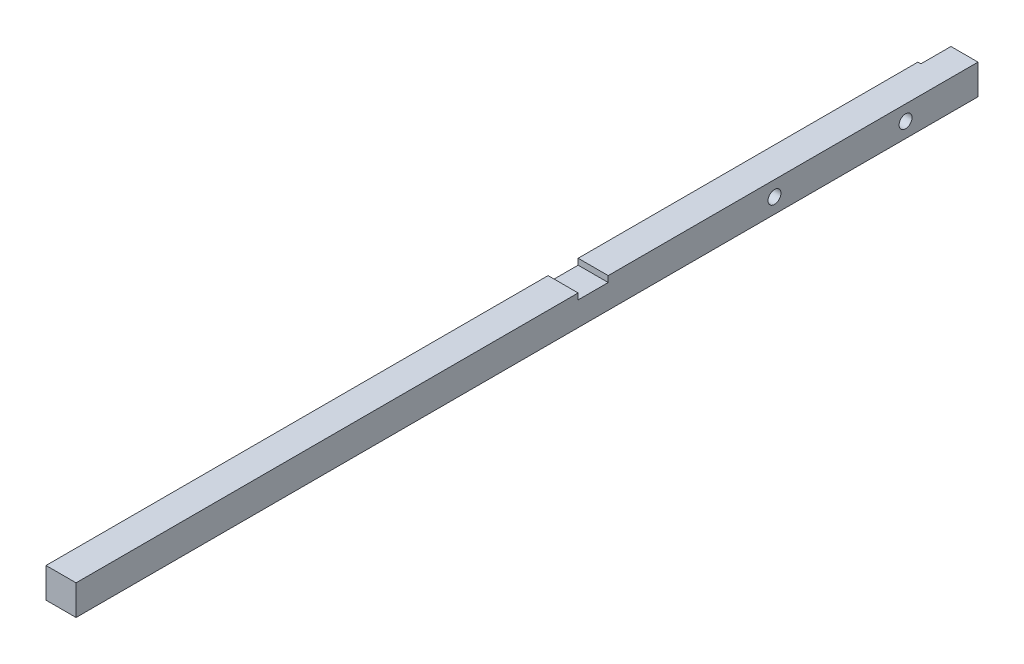
ISO-10303-21;
HEADER;
FILE_DESCRIPTION(('STEP AP214'),'2;1');
FILE_NAME('part.step','',(''),(''),'','','');
FILE_SCHEMA(('AUTOMOTIVE_DESIGN { 1 0 10303 214 1 1 1 1 }'));
ENDSEC;
DATA;
#1=APPLICATION_CONTEXT('core data for automotive mechanical design processes');
#2=APPLICATION_PROTOCOL_DEFINITION('international standard','automotive_design',2000,#1);
#3=PRODUCT_CONTEXT('',#1,'mechanical');
#4=PRODUCT('Part','Part','',(#3));
#5=PRODUCT_RELATED_PRODUCT_CATEGORY('part','',(#4));
#6=PRODUCT_DEFINITION_FORMATION('','',#4);
#7=PRODUCT_DEFINITION_CONTEXT('part definition',#1,'design');
#8=PRODUCT_DEFINITION('design','',#6,#7);
#9=PRODUCT_DEFINITION_SHAPE('','',#8);
#10=(LENGTH_UNIT() NAMED_UNIT(*) SI_UNIT(.MILLI.,.METRE.));
#11=(NAMED_UNIT(*) PLANE_ANGLE_UNIT() SI_UNIT($,.RADIAN.));
#12=(NAMED_UNIT(*) SI_UNIT($,.STERADIAN.) SOLID_ANGLE_UNIT());
#13=UNCERTAINTY_MEASURE_WITH_UNIT(LENGTH_MEASURE(1.E-05),#10,'distance_accuracy_value','');
#14=(GEOMETRIC_REPRESENTATION_CONTEXT(3) GLOBAL_UNCERTAINTY_ASSIGNED_CONTEXT((#13)) GLOBAL_UNIT_ASSIGNED_CONTEXT((#10,
#11,#12)) REPRESENTATION_CONTEXT('',''));
#15=CARTESIAN_POINT('',(0.,0.,0.));
#16=DIRECTION('',(0.,0.,1.));
#17=DIRECTION('',(1.,0.,0.));
#18=AXIS2_PLACEMENT_3D('',#15,#16,#17);
#19=CARTESIAN_POINT('',(-5.,5.,323.142135623731));
#20=DIRECTION('',(0.,-1.,0.));
#21=DIRECTION('',(0.,0.,-1.));
#22=AXIS2_PLACEMENT_3D('',#19,#20,#21);
#23=PLANE('',#22);
#24=DIRECTION('',(0.,0.,-1.));
#25=VECTOR('',#24,1.);
#26=CARTESIAN_POINT('',(5.,5.,323.142135623731));
#27=LINE('',#26,#25);
#28=CARTESIAN_POINT('',(5.,5.,307.));
#29=VERTEX_POINT('',#28);
#30=CARTESIAN_POINT('',(5.,5.,140.));
#31=VERTEX_POINT('',#30);
#32=EDGE_CURVE('E151',#29,#31,#27,.T.);
#33=ORIENTED_EDGE('',*,*,#32,.T.);
#34=DIRECTION('',(1.,0.,0.));
#35=VECTOR('',#34,1.);
#36=CARTESIAN_POINT('',(-5.,5.,140.));
#37=LINE('',#36,#35);
#38=CARTESIAN_POINT('',(-5.,5.,140.));
#39=VERTEX_POINT('',#38);
#40=EDGE_CURVE('E191',#39,#31,#37,.T.);
#41=ORIENTED_EDGE('',*,*,#40,.F.);
#42=DIRECTION('',(0.,0.,-1.));
#43=VECTOR('',#42,1.);
#44=CARTESIAN_POINT('',(-5.,5.,323.142135623731));
#45=LINE('',#44,#43);
#46=CARTESIAN_POINT('',(-5.,5.,307.));
#47=VERTEX_POINT('',#46);
#48=EDGE_CURVE('E37',#47,#39,#45,.T.);
#49=ORIENTED_EDGE('',*,*,#48,.F.);
#50=DIRECTION('',(-1.,0.,0.));
#51=VECTOR('',#50,1.);
#52=CARTESIAN_POINT('',(-5.,5.,307.));
#53=LINE('',#52,#51);
#54=EDGE_CURVE('E148',#29,#47,#53,.T.);
#55=ORIENTED_EDGE('',*,*,#54,.F.);
#56=EDGE_LOOP('',(#33,#41,#49,#55));
#57=FACE_BOUND('',#56,.T.);
#58=ADVANCED_FACE('F33',(#57),#23,.F.);
#59=CARTESIAN_POINT('',(-5.,5.,323.142135623731));
#60=DIRECTION('',(1.,0.,0.));
#61=DIRECTION('',(0.,1.,0.));
#62=AXIS2_PLACEMENT_3D('',#59,#60,#61);
#63=PLANE('',#62);
#64=CARTESIAN_POINT('',(-5.,0.,74.69));
#65=DIRECTION('',(-1.,0.,0.));
#66=DIRECTION('',(0.,0.,1.));
#67=AXIS2_PLACEMENT_3D('',#64,#65,#66);
#68=CIRCLE('',#67,2.14999999999999);
#69=CARTESIAN_POINT('',(-5.,0.,76.84));
#70=VERTEX_POINT('',#69);
#71=EDGE_CURVE('E255',#70,#70,#68,.T.);
#72=ORIENTED_EDGE('',*,*,#71,.F.);
#73=EDGE_LOOP('',(#72));
#74=FACE_BOUND('',#73,.T.);
#75=CARTESIAN_POINT('',(-5.,0.,31.09));
#76=DIRECTION('',(-1.,0.,0.));
#77=DIRECTION('',(0.,0.,1.));
#78=AXIS2_PLACEMENT_3D('',#75,#76,#77);
#79=CIRCLE('',#78,2.14999999999999);
#80=CARTESIAN_POINT('',(-5.,0.,33.24));
#81=VERTEX_POINT('',#80);
#82=EDGE_CURVE('E249',#81,#81,#79,.T.);
#83=ORIENTED_EDGE('',*,*,#82,.F.);
#84=EDGE_LOOP('',(#83));
#85=FACE_BOUND('',#84,.T.);
#86=CARTESIAN_POINT('',(-5.,5.,130.));
#87=VERTEX_POINT('',#86);
#88=CARTESIAN_POINT('',(-5.,4.99999999999999,17.));
#89=VERTEX_POINT('',#88);
#90=EDGE_CURVE('E193',#87,#89,#45,.T.);
#91=ORIENTED_EDGE('',*,*,#90,.T.);
#92=DIRECTION('',(0.,1.,0.));
#93=VECTOR('',#92,1.);
#94=CARTESIAN_POINT('',(-5.,-5.,17.));
#95=LINE('',#94,#93);
#96=CARTESIAN_POINT('',(-5.,-5.,17.));
#97=VERTEX_POINT('',#96);
#98=EDGE_CURVE('E120',#97,#89,#95,.T.);
#99=ORIENTED_EDGE('',*,*,#98,.F.);
#100=DIRECTION('',(0.,0.,-1.));
#101=VECTOR('',#100,1.);
#102=CARTESIAN_POINT('',(-5.,-5.,323.142135623731));
#103=LINE('',#102,#101);
#104=CARTESIAN_POINT('',(-5.,-5.,307.));
#105=VERTEX_POINT('',#104);
#106=EDGE_CURVE('E136',#105,#97,#103,.T.);
#107=ORIENTED_EDGE('',*,*,#106,.F.);
#108=DIRECTION('',(0.,-1.,0.));
#109=VECTOR('',#108,1.);
#110=CARTESIAN_POINT('',(-5.,5.,307.));
#111=LINE('',#110,#109);
#112=EDGE_CURVE('E145',#47,#105,#111,.T.);
#113=ORIENTED_EDGE('',*,*,#112,.F.);
#114=ORIENTED_EDGE('',*,*,#48,.T.);
#115=DIRECTION('',(0.,-1.,0.));
#116=VECTOR('',#115,1.);
#117=CARTESIAN_POINT('',(-5.,5.,140.));
#118=LINE('',#117,#116);
#119=CARTESIAN_POINT('',(-5.,3.,140.));
#120=VERTEX_POINT('',#119);
#121=EDGE_CURVE('E175',#39,#120,#118,.T.);
#122=ORIENTED_EDGE('',*,*,#121,.T.);
#123=DIRECTION('',(0.,0.,-1.));
#124=VECTOR('',#123,1.);
#125=CARTESIAN_POINT('',(-5.,3.,140.));
#126=LINE('',#125,#124);
#127=CARTESIAN_POINT('',(-5.,3.,130.));
#128=VERTEX_POINT('',#127);
#129=EDGE_CURVE('E178',#120,#128,#126,.T.);
#130=ORIENTED_EDGE('',*,*,#129,.T.);
#131=DIRECTION('',(0.,1.,0.));
#132=VECTOR('',#131,1.);
#133=CARTESIAN_POINT('',(-5.,5.,130.));
#134=LINE('',#133,#132);
#135=EDGE_CURVE('E181',#128,#87,#134,.T.);
#136=ORIENTED_EDGE('',*,*,#135,.T.);
#137=EDGE_LOOP('',(#91,#99,#107,#113,#114,#122,#130,#136));
#138=FACE_BOUND('',#137,.T.);
#139=ADVANCED_FACE('F210',(#74,#85,#138),#63,.F.);
#140=CARTESIAN_POINT('',(-5.,-5.,323.142135623731));
#141=DIRECTION('',(0.,1.,0.));
#142=DIRECTION('',(0.,0.,1.));
#143=AXIS2_PLACEMENT_3D('',#140,#141,#142);
#144=PLANE('',#143);
#145=ORIENTED_EDGE('',*,*,#106,.T.);
#146=DIRECTION('',(-1.,0.,0.));
#147=VECTOR('',#146,1.);
#148=CARTESIAN_POINT('',(-4.,-5.,17.));
#149=LINE('',#148,#147);
#150=CARTESIAN_POINT('',(-4.,-5.,17.));
#151=VERTEX_POINT('',#150);
#152=EDGE_CURVE('E128',#151,#97,#149,.T.);
#153=ORIENTED_EDGE('',*,*,#152,.F.);
#154=DIRECTION('',(0.,0.,1.));
#155=VECTOR('',#154,1.);
#156=CARTESIAN_POINT('',(-4.,-5.,7.));
#157=LINE('',#156,#155);
#158=CARTESIAN_POINT('',(-4.,-5.,7.));
#159=VERTEX_POINT('',#158);
#160=EDGE_CURVE('E114',#159,#151,#157,.T.);
#161=ORIENTED_EDGE('',*,*,#160,.F.);
#162=DIRECTION('',(1.,0.,0.));
#163=VECTOR('',#162,1.);
#164=CARTESIAN_POINT('',(-5.,-5.,7.));
#165=LINE('',#164,#163);
#166=CARTESIAN_POINT('',(5.,-5.,7.));
#167=VERTEX_POINT('',#166);
#168=EDGE_CURVE('E126',#159,#167,#165,.T.);
#169=ORIENTED_EDGE('',*,*,#168,.T.);
#170=DIRECTION('',(0.,0.,-1.));
#171=VECTOR('',#170,1.);
#172=CARTESIAN_POINT('',(5.,-5.,323.142135623731));
#173=LINE('',#172,#171);
#174=CARTESIAN_POINT('',(5.,-5.,307.));
#175=VERTEX_POINT('',#174);
#176=EDGE_CURVE('E135',#175,#167,#173,.T.);
#177=ORIENTED_EDGE('',*,*,#176,.F.);
#178=DIRECTION('',(1.,0.,0.));
#179=VECTOR('',#178,1.);
#180=CARTESIAN_POINT('',(-5.,-5.,307.));
#181=LINE('',#180,#179);
#182=EDGE_CURVE('E42',#105,#175,#181,.T.);
#183=ORIENTED_EDGE('',*,*,#182,.F.);
#184=EDGE_LOOP('',(#145,#153,#161,#169,#177,#183));
#185=FACE_BOUND('',#184,.T.);
#186=ADVANCED_FACE('F124',(#185),#144,.F.);
#187=CARTESIAN_POINT('',(5.,5.,323.142135623731));
#188=DIRECTION('',(-1.,0.,0.));
#189=DIRECTION('',(0.,-1.,0.));
#190=AXIS2_PLACEMENT_3D('',#187,#188,#189);
#191=PLANE('',#190);
#192=CARTESIAN_POINT('',(5.,0.,74.69));
#193=DIRECTION('',(-1.,0.,0.));
#194=DIRECTION('',(0.,0.,1.));
#195=AXIS2_PLACEMENT_3D('',#192,#193,#194);
#196=CIRCLE('',#195,2.15);
#197=CARTESIAN_POINT('',(5.,0.,76.84));
#198=VERTEX_POINT('',#197);
#199=EDGE_CURVE('E245',#198,#198,#196,.T.);
#200=ORIENTED_EDGE('',*,*,#199,.T.);
#201=EDGE_LOOP('',(#200));
#202=FACE_BOUND('',#201,.T.);
#203=CARTESIAN_POINT('',(5.,0.,31.09));
#204=DIRECTION('',(-1.,0.,0.));
#205=DIRECTION('',(0.,0.,1.));
#206=AXIS2_PLACEMENT_3D('',#203,#204,#205);
#207=CIRCLE('',#206,2.15);
#208=CARTESIAN_POINT('',(5.,0.,33.24));
#209=VERTEX_POINT('',#208);
#210=EDGE_CURVE('E172',#209,#209,#207,.T.);
#211=ORIENTED_EDGE('',*,*,#210,.T.);
#212=EDGE_LOOP('',(#211));
#213=FACE_BOUND('',#212,.T.);
#214=DIRECTION('',(0.,0.,-1.));
#215=VECTOR('',#214,1.);
#216=CARTESIAN_POINT('',(5.,3.,140.));
#217=LINE('',#216,#215);
#218=CARTESIAN_POINT('',(5.,3.,140.));
#219=VERTEX_POINT('',#218);
#220=CARTESIAN_POINT('',(5.,3.,130.));
#221=VERTEX_POINT('',#220);
#222=EDGE_CURVE('E187',#219,#221,#217,.T.);
#223=ORIENTED_EDGE('',*,*,#222,.F.);
#224=DIRECTION('',(0.,-1.,0.));
#225=VECTOR('',#224,1.);
#226=CARTESIAN_POINT('',(5.,5.,140.));
#227=LINE('',#226,#225);
#228=EDGE_CURVE('E173',#31,#219,#227,.T.);
#229=ORIENTED_EDGE('',*,*,#228,.F.);
#230=ORIENTED_EDGE('',*,*,#32,.F.);
#231=DIRECTION('',(0.,1.,0.));
#232=VECTOR('',#231,1.);
#233=CARTESIAN_POINT('',(5.,5.,307.));
#234=LINE('',#233,#232);
#235=EDGE_CURVE('E12',#175,#29,#234,.T.);
#236=ORIENTED_EDGE('',*,*,#235,.F.);
#237=ORIENTED_EDGE('',*,*,#176,.T.);
#238=DIRECTION('',(0.,1.,0.));
#239=VECTOR('',#238,1.);
#240=CARTESIAN_POINT('',(5.,5.,7.));
#241=LINE('',#240,#239);
#242=CARTESIAN_POINT('',(5.,5.,7.));
#243=VERTEX_POINT('',#242);
#244=EDGE_CURVE('E134',#167,#243,#241,.T.);
#245=ORIENTED_EDGE('',*,*,#244,.T.);
#246=CARTESIAN_POINT('',(5.,5.,130.));
#247=VERTEX_POINT('',#246);
#248=EDGE_CURVE('E153',#247,#243,#27,.T.);
#249=ORIENTED_EDGE('',*,*,#248,.F.);
#250=DIRECTION('',(0.,1.,0.));
#251=VECTOR('',#250,1.);
#252=CARTESIAN_POINT('',(5.,5.,130.));
#253=LINE('',#252,#251);
#254=EDGE_CURVE('E58',#221,#247,#253,.T.);
#255=ORIENTED_EDGE('',*,*,#254,.F.);
#256=EDGE_LOOP('',(#223,#229,#230,#236,#237,#245,#249,#255));
#257=FACE_BOUND('',#256,.T.);
#258=ADVANCED_FACE('F161',(#202,#213,#257),#191,.F.);
#259=DIRECTION('',(0.,0.,-1.));
#260=VECTOR('',#259,1.);
#261=CARTESIAN_POINT('',(-4.,4.99999999999999,7.));
#262=LINE('',#261,#260);
#263=CARTESIAN_POINT('',(-4.,4.99999999999999,17.));
#264=VERTEX_POINT('',#263);
#265=CARTESIAN_POINT('',(-4.,5.,7.));
#266=VERTEX_POINT('',#265);
#267=EDGE_CURVE('E50',#264,#266,#262,.T.);
#268=ORIENTED_EDGE('',*,*,#267,.F.);
#269=DIRECTION('',(-1.,0.,0.));
#270=VECTOR('',#269,1.);
#271=CARTESIAN_POINT('',(-4.,4.99999999999999,17.));
#272=LINE('',#271,#270);
#273=EDGE_CURVE('E165',#264,#89,#272,.T.);
#274=ORIENTED_EDGE('',*,*,#273,.T.);
#275=ORIENTED_EDGE('',*,*,#90,.F.);
#276=DIRECTION('',(1.,0.,0.));
#277=VECTOR('',#276,1.);
#278=CARTESIAN_POINT('',(-5.,5.,130.));
#279=LINE('',#278,#277);
#280=EDGE_CURVE('E194',#87,#247,#279,.T.);
#281=ORIENTED_EDGE('',*,*,#280,.T.);
#282=ORIENTED_EDGE('',*,*,#248,.T.);
#283=DIRECTION('',(-1.,0.,0.));
#284=VECTOR('',#283,1.);
#285=CARTESIAN_POINT('',(-5.,5.,7.));
#286=LINE('',#285,#284);
#287=EDGE_CURVE('E150',#243,#266,#286,.T.);
#288=ORIENTED_EDGE('',*,*,#287,.T.);
#289=EDGE_LOOP('',(#268,#274,#275,#281,#282,#288));
#290=FACE_BOUND('',#289,.T.);
#291=ADVANCED_FACE('F162',(#290),#23,.F.);
#292=CARTESIAN_POINT('',(0.,0.,7.));
#293=DIRECTION('',(0.,0.,1.));
#294=DIRECTION('',(1.,0.,0.));
#295=AXIS2_PLACEMENT_3D('',#292,#293,#294);
#296=PLANE('',#295);
#297=ORIENTED_EDGE('',*,*,#168,.F.);
#298=DIRECTION('',(0.,-1.,0.));
#299=VECTOR('',#298,1.);
#300=CARTESIAN_POINT('',(-4.,-5.,7.));
#301=LINE('',#300,#299);
#302=EDGE_CURVE('E111',#266,#159,#301,.T.);
#303=ORIENTED_EDGE('',*,*,#302,.F.);
#304=ORIENTED_EDGE('',*,*,#287,.F.);
#305=ORIENTED_EDGE('',*,*,#244,.F.);
#306=EDGE_LOOP('',(#297,#303,#304,#305));
#307=FACE_BOUND('',#306,.T.);
#308=ADVANCED_FACE('F132',(#307),#296,.F.);
#309=CARTESIAN_POINT('',(5.,247.,307.));
#310=DIRECTION('',(0.,0.,1.));
#311=DIRECTION('',(0.,1.,0.));
#312=AXIS2_PLACEMENT_3D('',#309,#310,#311);
#313=PLANE('',#312);
#314=ORIENTED_EDGE('',*,*,#54,.T.);
#315=ORIENTED_EDGE('',*,*,#112,.T.);
#316=ORIENTED_EDGE('',*,*,#182,.T.);
#317=ORIENTED_EDGE('',*,*,#235,.T.);
#318=EDGE_LOOP('',(#314,#315,#316,#317));
#319=FACE_BOUND('',#318,.T.);
#320=ADVANCED_FACE('F35',(#319),#313,.T.);
#321=CARTESIAN_POINT('',(-5.,5.,140.));
#322=DIRECTION('',(0.,0.,1.));
#323=DIRECTION('',(1.,0.,0.));
#324=AXIS2_PLACEMENT_3D('',#321,#322,#323);
#325=PLANE('',#324);
#326=ORIENTED_EDGE('',*,*,#228,.T.);
#327=DIRECTION('',(1.,0.,0.));
#328=VECTOR('',#327,1.);
#329=CARTESIAN_POINT('',(-5.,3.,140.));
#330=LINE('',#329,#328);
#331=EDGE_CURVE('E184',#120,#219,#330,.T.);
#332=ORIENTED_EDGE('',*,*,#331,.F.);
#333=ORIENTED_EDGE('',*,*,#121,.F.);
#334=ORIENTED_EDGE('',*,*,#40,.T.);
#335=EDGE_LOOP('',(#326,#332,#333,#334));
#336=FACE_BOUND('',#335,.T.);
#337=ADVANCED_FACE('F203',(#336),#325,.F.);
#338=CARTESIAN_POINT('',(-5.,5.,130.));
#339=DIRECTION('',(0.,0.,-1.));
#340=DIRECTION('',(-1.,0.,0.));
#341=AXIS2_PLACEMENT_3D('',#338,#339,#340);
#342=PLANE('',#341);
#343=ORIENTED_EDGE('',*,*,#254,.T.);
#344=ORIENTED_EDGE('',*,*,#280,.F.);
#345=ORIENTED_EDGE('',*,*,#135,.F.);
#346=DIRECTION('',(1.,0.,0.));
#347=VECTOR('',#346,1.);
#348=CARTESIAN_POINT('',(-5.,3.,130.));
#349=LINE('',#348,#347);
#350=EDGE_CURVE('E196',#128,#221,#349,.T.);
#351=ORIENTED_EDGE('',*,*,#350,.T.);
#352=EDGE_LOOP('',(#343,#344,#345,#351));
#353=FACE_BOUND('',#352,.T.);
#354=ADVANCED_FACE('F221',(#353),#342,.F.);
#355=CARTESIAN_POINT('',(-5.,3.,140.));
#356=DIRECTION('',(0.,-1.,0.));
#357=DIRECTION('',(0.,0.,-1.));
#358=AXIS2_PLACEMENT_3D('',#355,#356,#357);
#359=PLANE('',#358);
#360=ORIENTED_EDGE('',*,*,#222,.T.);
#361=ORIENTED_EDGE('',*,*,#350,.F.);
#362=ORIENTED_EDGE('',*,*,#129,.F.);
#363=ORIENTED_EDGE('',*,*,#331,.T.);
#364=EDGE_LOOP('',(#360,#361,#362,#363));
#365=FACE_BOUND('',#364,.T.);
#366=ADVANCED_FACE('F200',(#365),#359,.F.);
#367=CARTESIAN_POINT('',(-4.,-5.,17.));
#368=DIRECTION('',(0.,0.,1.));
#369=DIRECTION('',(1.,0.,0.));
#370=AXIS2_PLACEMENT_3D('',#367,#368,#369);
#371=PLANE('',#370);
#372=ORIENTED_EDGE('',*,*,#98,.T.);
#373=ORIENTED_EDGE('',*,*,#273,.F.);
#374=DIRECTION('',(0.,1.,0.));
#375=VECTOR('',#374,1.);
#376=CARTESIAN_POINT('',(-4.,-5.,17.));
#377=LINE('',#376,#375);
#378=EDGE_CURVE('E129',#151,#264,#377,.T.);
#379=ORIENTED_EDGE('',*,*,#378,.F.);
#380=ORIENTED_EDGE('',*,*,#152,.T.);
#381=EDGE_LOOP('',(#372,#373,#379,#380));
#382=FACE_BOUND('',#381,.T.);
#383=ADVANCED_FACE('F212',(#382),#371,.F.);
#384=CARTESIAN_POINT('',(-4.,0.,0.));
#385=DIRECTION('',(1.,0.,0.));
#386=DIRECTION('',(0.,0.,-1.));
#387=AXIS2_PLACEMENT_3D('',#384,#385,#386);
#388=PLANE('',#387);
#389=ORIENTED_EDGE('',*,*,#302,.T.);
#390=ORIENTED_EDGE('',*,*,#160,.T.);
#391=ORIENTED_EDGE('',*,*,#378,.T.);
#392=ORIENTED_EDGE('',*,*,#267,.T.);
#393=EDGE_LOOP('',(#389,#390,#391,#392));
#394=FACE_BOUND('',#393,.T.);
#395=ADVANCED_FACE('F113',(#394),#388,.F.);
#396=CARTESIAN_POINT('',(-5.,0.,31.09));
#397=DIRECTION('',(-1.,0.,0.));
#398=DIRECTION('',(0.,0.,1.));
#399=AXIS2_PLACEMENT_3D('',#396,#397,#398);
#400=CYLINDRICAL_SURFACE('',#399,2.14999999999999);
#401=ORIENTED_EDGE('',*,*,#210,.F.);
#402=EDGE_LOOP('',(#401));
#403=FACE_BOUND('',#402,.T.);
#404=ORIENTED_EDGE('',*,*,#82,.T.);
#405=EDGE_LOOP('',(#404));
#406=FACE_BOUND('',#405,.T.);
#407=ADVANCED_FACE('F219',(#403,#406),#400,.F.);
#408=CARTESIAN_POINT('',(-5.,0.,74.69));
#409=DIRECTION('',(-1.,0.,0.));
#410=DIRECTION('',(0.,0.,1.));
#411=AXIS2_PLACEMENT_3D('',#408,#409,#410);
#412=CYLINDRICAL_SURFACE('',#411,2.14999999999999);
#413=ORIENTED_EDGE('',*,*,#199,.F.);
#414=EDGE_LOOP('',(#413));
#415=FACE_BOUND('',#414,.T.);
#416=ORIENTED_EDGE('',*,*,#71,.T.);
#417=EDGE_LOOP('',(#416));
#418=FACE_BOUND('',#417,.T.);
#419=ADVANCED_FACE('F259',(#415,#418),#412,.F.);
#420=CLOSED_SHELL('',(#58,#139,#186,#258,#291,#308,#320,#337,#354,#366,#383,#395,#407,#419));
#421=MANIFOLD_SOLID_BREP('B2',#420);
#422=ADVANCED_BREP_SHAPE_REPRESENTATION('',(#18,#421),#14);
#423=SHAPE_DEFINITION_REPRESENTATION(#9,#422);
ENDSEC;
END-ISO-10303-21;
